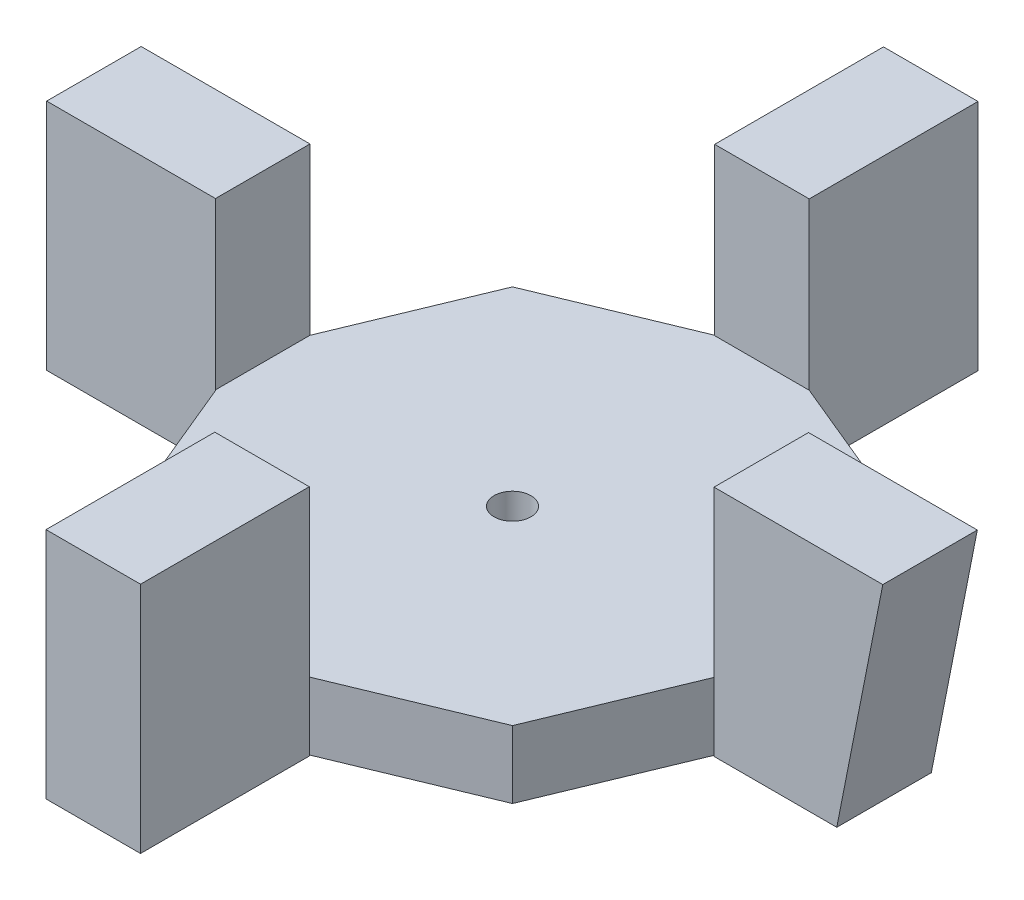
ISO-10303-21;
HEADER;
FILE_DESCRIPTION(('STEP AP214'),'2;1');
FILE_NAME('part.step','',(''),(''),'','','');
FILE_SCHEMA(('AUTOMOTIVE_DESIGN { 1 0 10303 214 1 1 1 1 }'));
ENDSEC;
DATA;
#1=APPLICATION_CONTEXT('core data for automotive mechanical design processes');
#2=APPLICATION_PROTOCOL_DEFINITION('international standard','automotive_design',2000,#1);
#3=PRODUCT_CONTEXT('',#1,'mechanical');
#4=PRODUCT('Part','Part','',(#3));
#5=PRODUCT_RELATED_PRODUCT_CATEGORY('part','',(#4));
#6=PRODUCT_DEFINITION_FORMATION('','',#4);
#7=PRODUCT_DEFINITION_CONTEXT('part definition',#1,'design');
#8=PRODUCT_DEFINITION('design','',#6,#7);
#9=PRODUCT_DEFINITION_SHAPE('','',#8);
#10=(LENGTH_UNIT() NAMED_UNIT(*) SI_UNIT(.MILLI.,.METRE.));
#11=(NAMED_UNIT(*) PLANE_ANGLE_UNIT() SI_UNIT($,.RADIAN.));
#12=(NAMED_UNIT(*) SI_UNIT($,.STERADIAN.) SOLID_ANGLE_UNIT());
#13=UNCERTAINTY_MEASURE_WITH_UNIT(LENGTH_MEASURE(1.E-05),#10,'distance_accuracy_value','');
#14=(GEOMETRIC_REPRESENTATION_CONTEXT(3) GLOBAL_UNCERTAINTY_ASSIGNED_CONTEXT((#13)) GLOBAL_UNIT_ASSIGNED_CONTEXT((#10,
#11,#12)) REPRESENTATION_CONTEXT('',''));
#15=CARTESIAN_POINT('',(0.,0.,0.));
#16=DIRECTION('',(0.,0.,1.));
#17=DIRECTION('',(1.,0.,0.));
#18=AXIS2_PLACEMENT_3D('',#15,#16,#17);
#19=CARTESIAN_POINT('',(0.,2.75,0.));
#20=DIRECTION('',(0.,1.,0.));
#21=DIRECTION('',(0.,0.,1.));
#22=AXIS2_PLACEMENT_3D('',#19,#20,#21);
#23=PLANE('',#22);
#24=CARTESIAN_POINT('',(0.,2.75,0.));
#25=DIRECTION('',(0.,1.,0.));
#26=DIRECTION('',(0.,0.,1.));
#27=AXIS2_PLACEMENT_3D('',#24,#25,#26);
#28=CIRCLE('',#27,1.5);
#29=CARTESIAN_POINT('',(0.,2.75,1.5));
#30=VERTEX_POINT('',#29);
#31=EDGE_CURVE('E294',#30,#30,#28,.T.);
#32=ORIENTED_EDGE('',*,*,#31,.F.);
#33=EDGE_LOOP('',(#32));
#34=FACE_BOUND('',#33,.T.);
#35=DIRECTION('',(0.382683432365083,0.,-0.92387953251129));
#36=VECTOR('',#35,1.);
#37=CARTESIAN_POINT('',(18.6803767433291,2.75,7.73766539732571));
#38=LINE('',#37,#36);
#39=CARTESIAN_POINT('',(15.4753307946518,2.75,15.4753307946516));
#40=VERTEX_POINT('',#39);
#41=CARTESIAN_POINT('',(20.3613567830072,2.75,3.6794205874563));
#42=VERTEX_POINT('',#41);
#43=EDGE_CURVE('E457',#40,#42,#38,.T.);
#44=ORIENTED_EDGE('',*,*,#43,.T.);
#45=DIRECTION('',(0.,0.,-1.));
#46=VECTOR('',#45,1.);
#47=CARTESIAN_POINT('',(20.3613567830072,2.75,0.));
#48=LINE('',#47,#46);
#49=CARTESIAN_POINT('',(20.3613567830072,2.75,-3.67942058745647));
#50=VERTEX_POINT('',#49);
#51=EDGE_CURVE('E401',#42,#50,#48,.T.);
#52=ORIENTED_EDGE('',*,*,#51,.T.);
#53=DIRECTION('',(-0.382683432365095,0.,-0.923879532511284));
#54=VECTOR('',#53,1.);
#55=CARTESIAN_POINT('',(18.680376743329,2.75,-7.73766539732596));
#56=LINE('',#55,#54);
#57=CARTESIAN_POINT('',(15.4753307946516,2.75,-15.4753307946518));
#58=VERTEX_POINT('',#57);
#59=EDGE_CURVE('E459',#50,#58,#56,.T.);
#60=ORIENTED_EDGE('',*,*,#59,.T.);
#61=DIRECTION('',(-0.923879532511289,0.,-0.382683432365084));
#62=VECTOR('',#61,1.);
#63=CARTESIAN_POINT('',(7.73766539732573,2.75,-18.6803767433291));
#64=LINE('',#63,#62);
#65=CARTESIAN_POINT('',(3.90464976156508,2.75,-20.2680638044493));
#66=VERTEX_POINT('',#65);
#67=EDGE_CURVE('E461',#58,#66,#64,.T.);
#68=ORIENTED_EDGE('',*,*,#67,.T.);
#69=DIRECTION('',(-1.,0.,0.));
#70=VECTOR('',#69,1.);
#71=CARTESIAN_POINT('',(0.,2.75,-20.2680638044493));
#72=LINE('',#71,#70);
#73=CARTESIAN_POINT('',(-3.79535023843491,2.75,-20.2680638044493));
#74=VERTEX_POINT('',#73);
#75=EDGE_CURVE('E426',#66,#74,#72,.T.);
#76=ORIENTED_EDGE('',*,*,#75,.T.);
#77=DIRECTION('',(0.,0.,1.));
#78=VECTOR('',#77,1.);
#79=CARTESIAN_POINT('',(-3.7953502384349,2.75,0.));
#80=LINE('',#79,#78);
#81=CARTESIAN_POINT('',(-3.79535023843491,2.75,-20.3133371492908));
#82=VERTEX_POINT('',#81);
#83=EDGE_CURVE('E424',#82,#74,#80,.T.);
#84=ORIENTED_EDGE('',*,*,#83,.F.);
#85=DIRECTION('',(-0.923879532511285,0.,0.382683432365095));
#86=VECTOR('',#85,1.);
#87=CARTESIAN_POINT('',(-7.73766539732596,2.75,-18.680376743329));
#88=LINE('',#87,#86);
#89=CARTESIAN_POINT('',(-15.4753307946518,2.75,-15.4753307946516));
#90=VERTEX_POINT('',#89);
#91=EDGE_CURVE('E60',#82,#90,#88,.T.);
#92=ORIENTED_EDGE('',*,*,#91,.T.);
#93=DIRECTION('',(-0.382683432365084,0.,0.923879532511289));
#94=VECTOR('',#93,1.);
#95=CARTESIAN_POINT('',(-18.6803767433291,2.75,-7.73766539732573));
#96=LINE('',#95,#94);
#97=CARTESIAN_POINT('',(-20.3067070214421,2.75,-3.8113567830072));
#98=VERTEX_POINT('',#97);
#99=EDGE_CURVE('E465',#90,#98,#96,.T.);
#100=ORIENTED_EDGE('',*,*,#99,.T.);
#101=DIRECTION('',(0.,0.,1.));
#102=VECTOR('',#101,1.);
#103=CARTESIAN_POINT('',(-20.3067070214421,2.75,0.));
#104=LINE('',#103,#102);
#105=CARTESIAN_POINT('',(-20.3067070214421,2.75,3.81135678300735));
#106=VERTEX_POINT('',#105);
#107=EDGE_CURVE('E11',#98,#106,#104,.T.);
#108=ORIENTED_EDGE('',*,*,#107,.T.);
#109=DIRECTION('',(0.382683432365096,0.,0.923879532511284));
#110=VECTOR('',#109,1.);
#111=CARTESIAN_POINT('',(-18.680376743329,2.75,7.73766539732596));
#112=LINE('',#111,#110);
#113=CARTESIAN_POINT('',(-15.4753307946516,2.75,15.4753307946518));
#114=VERTEX_POINT('',#113);
#115=EDGE_CURVE('E150',#106,#114,#112,.T.);
#116=ORIENTED_EDGE('',*,*,#115,.T.);
#117=DIRECTION('',(0.923879532511289,0.,0.382683432365084));
#118=VECTOR('',#117,1.);
#119=CARTESIAN_POINT('',(-7.73766539732573,2.75,18.6803767433291));
#120=LINE('',#119,#118);
#121=CARTESIAN_POINT('',(-3.5861276088986,2.75,20.4));
#122=VERTEX_POINT('',#121);
#123=EDGE_CURVE('E351',#114,#122,#120,.T.);
#124=ORIENTED_EDGE('',*,*,#123,.T.);
#125=DIRECTION('',(-1.,0.,0.));
#126=VECTOR('',#125,1.);
#127=CARTESIAN_POINT('',(0.,2.75,20.4));
#128=LINE('',#127,#126);
#129=CARTESIAN_POINT('',(3.58612760889877,2.75,20.4));
#130=VERTEX_POINT('',#129);
#131=EDGE_CURVE('E52',#130,#122,#128,.T.);
#132=ORIENTED_EDGE('',*,*,#131,.F.);
#133=DIRECTION('',(0.923879532511284,0.,-0.382683432365096));
#134=VECTOR('',#133,1.);
#135=CARTESIAN_POINT('',(7.73766539732596,2.75,18.680376743329));
#136=LINE('',#135,#134);
#137=EDGE_CURVE('E354',#130,#40,#136,.T.);
#138=ORIENTED_EDGE('',*,*,#137,.T.);
#139=EDGE_LOOP('',(#44,#52,#60,#68,#76,#84,#92,#100,#108,#116,#124,#132,#138));
#140=FACE_BOUND('',#139,.T.);
#141=ADVANCED_FACE('F43',(#34,#140),#23,.T.);
#142=CARTESIAN_POINT('',(-20.3067070214421,2.75,0.));
#143=DIRECTION('',(-1.,0.,0.));
#144=DIRECTION('',(0.,0.,1.));
#145=AXIS2_PLACEMENT_3D('',#142,#143,#144);
#146=PLANE('',#145);
#147=DIRECTION('',(0.,-1.,0.));
#148=VECTOR('',#147,1.);
#149=CARTESIAN_POINT('',(-20.3067070214421,2.75,3.88864321699279));
#150=LINE('',#149,#148);
#151=CARTESIAN_POINT('',(-20.3067070214421,16.25,3.88864321699279));
#152=VERTEX_POINT('',#151);
#153=CARTESIAN_POINT('',(-20.3067070214421,-2.75,3.88864321699279));
#154=VERTEX_POINT('',#153);
#155=EDGE_CURVE('E144',#152,#154,#150,.T.);
#156=ORIENTED_EDGE('',*,*,#155,.T.);
#157=DIRECTION('',(0.,0.,-1.));
#158=VECTOR('',#157,1.);
#159=CARTESIAN_POINT('',(-20.3067070214421,-2.75,0.));
#160=LINE('',#159,#158);
#161=CARTESIAN_POINT('',(-20.3067070214421,-2.75,3.81135678300735));
#162=VERTEX_POINT('',#161);
#163=EDGE_CURVE('E454',#154,#162,#160,.T.);
#164=ORIENTED_EDGE('',*,*,#163,.T.);
#165=DIRECTION('',(0.,-1.,0.));
#166=VECTOR('',#165,1.);
#167=CARTESIAN_POINT('',(-20.3067070214421,2.75,3.81135678300735));
#168=LINE('',#167,#166);
#169=EDGE_CURVE('E341',#106,#162,#168,.T.);
#170=ORIENTED_EDGE('',*,*,#169,.F.);
#171=ORIENTED_EDGE('',*,*,#107,.F.);
#172=DIRECTION('',(0.,-1.,0.));
#173=VECTOR('',#172,1.);
#174=CARTESIAN_POINT('',(-20.3067070214421,16.25,-3.8113567830072));
#175=LINE('',#174,#173);
#176=CARTESIAN_POINT('',(-20.3067070214421,16.25,-3.8113567830072));
#177=VERTEX_POINT('',#176);
#178=EDGE_CURVE('E439',#177,#98,#175,.T.);
#179=ORIENTED_EDGE('',*,*,#178,.F.);
#180=DIRECTION('',(0.,0.,-1.));
#181=VECTOR('',#180,1.);
#182=CARTESIAN_POINT('',(-20.3067070214421,16.25,0.));
#183=LINE('',#182,#181);
#184=EDGE_CURVE('E429',#152,#177,#183,.T.);
#185=ORIENTED_EDGE('',*,*,#184,.F.);
#186=EDGE_LOOP('',(#156,#164,#170,#171,#179,#185));
#187=FACE_BOUND('',#186,.T.);
#188=ADVANCED_FACE('F45',(#187),#146,.F.);
#189=CARTESIAN_POINT('',(-18.680376743329,2.75,7.73766539732596));
#190=DIRECTION('',(0.923879532511285,0.,-0.382683432365096));
#191=DIRECTION('',(-0.382683432365095,0.,-0.923879532511284));
#192=AXIS2_PLACEMENT_3D('',#189,#190,#191);
#193=PLANE('',#192);
#194=DIRECTION('',(0.382683432365096,0.,0.923879532511284));
#195=VECTOR('',#194,1.);
#196=CARTESIAN_POINT('',(-18.680376743329,-2.75,7.73766539732596));
#197=LINE('',#196,#195);
#198=CARTESIAN_POINT('',(-15.4753307946516,-2.75,15.4753307946518));
#199=VERTEX_POINT('',#198);
#200=EDGE_CURVE('E362',#162,#199,#197,.T.);
#201=ORIENTED_EDGE('',*,*,#200,.T.);
#202=DIRECTION('',(0.,-1.,0.));
#203=VECTOR('',#202,1.);
#204=CARTESIAN_POINT('',(-15.4753307946516,2.75,15.4753307946518));
#205=LINE('',#204,#203);
#206=EDGE_CURVE('E338',#114,#199,#205,.T.);
#207=ORIENTED_EDGE('',*,*,#206,.F.);
#208=ORIENTED_EDGE('',*,*,#115,.F.);
#209=ORIENTED_EDGE('',*,*,#169,.T.);
#210=EDGE_LOOP('',(#201,#207,#208,#209));
#211=FACE_BOUND('',#210,.T.);
#212=ADVANCED_FACE('F471',(#211),#193,.F.);
#213=CARTESIAN_POINT('',(-7.73766539732573,2.75,18.6803767433291));
#214=DIRECTION('',(0.382683432365084,0.,-0.923879532511289));
#215=DIRECTION('',(-0.923879532511289,0.,-0.382683432365084));
#216=AXIS2_PLACEMENT_3D('',#213,#214,#215);
#217=PLANE('',#216);
#218=DIRECTION('',(0.923879532511289,0.,0.382683432365084));
#219=VECTOR('',#218,1.);
#220=CARTESIAN_POINT('',(-7.73766539732573,-2.75,18.6803767433291));
#221=LINE('',#220,#219);
#222=CARTESIAN_POINT('',(-3.5861276088986,-2.75,20.4));
#223=VERTEX_POINT('',#222);
#224=EDGE_CURVE('E358',#199,#223,#221,.T.);
#225=ORIENTED_EDGE('',*,*,#224,.T.);
#226=DIRECTION('',(0.,-1.,0.));
#227=VECTOR('',#226,1.);
#228=CARTESIAN_POINT('',(-3.5861276088986,2.75,20.4));
#229=LINE('',#228,#227);
#230=EDGE_CURVE('E336',#122,#223,#229,.T.);
#231=ORIENTED_EDGE('',*,*,#230,.F.);
#232=ORIENTED_EDGE('',*,*,#123,.F.);
#233=ORIENTED_EDGE('',*,*,#206,.T.);
#234=EDGE_LOOP('',(#225,#231,#232,#233));
#235=FACE_BOUND('',#234,.T.);
#236=ADVANCED_FACE('F356',(#235),#217,.F.);
#237=CARTESIAN_POINT('',(-3.84999999999996,2.75,0.));
#238=DIRECTION('',(-1.,0.,0.));
#239=DIRECTION('',(0.,0.,1.));
#240=AXIS2_PLACEMENT_3D('',#237,#238,#239);
#241=PLANE('',#240);
#242=DIRECTION('',(0.,-1.,0.));
#243=VECTOR('',#242,1.);
#244=CARTESIAN_POINT('',(-3.84999999999998,2.75,20.4));
#245=LINE('',#244,#243);
#246=CARTESIAN_POINT('',(-3.84999999999998,16.25,20.4));
#247=VERTEX_POINT('',#246);
#248=CARTESIAN_POINT('',(-3.84999999999998,-2.75,20.4));
#249=VERTEX_POINT('',#248);
#250=EDGE_CURVE('E334',#247,#249,#245,.T.);
#251=ORIENTED_EDGE('',*,*,#250,.T.);
#252=DIRECTION('',(0.,0.,-1.));
#253=VECTOR('',#252,1.);
#254=CARTESIAN_POINT('',(-3.84999999999996,-2.75,0.));
#255=LINE('',#254,#253);
#256=CARTESIAN_POINT('',(-3.85,-2.75,34.15));
#257=VERTEX_POINT('',#256);
#258=EDGE_CURVE('E367',#257,#249,#255,.T.);
#259=ORIENTED_EDGE('',*,*,#258,.F.);
#260=DIRECTION('',(0.,-1.,0.));
#261=VECTOR('',#260,1.);
#262=CARTESIAN_POINT('',(-3.85,2.75,34.15));
#263=LINE('',#262,#261);
#264=CARTESIAN_POINT('',(-3.85,16.25,34.15));
#265=VERTEX_POINT('',#264);
#266=EDGE_CURVE('E332',#265,#257,#263,.T.);
#267=ORIENTED_EDGE('',*,*,#266,.F.);
#268=DIRECTION('',(0.,0.,-1.));
#269=VECTOR('',#268,1.);
#270=CARTESIAN_POINT('',(-3.84999999999996,16.25,0.));
#271=LINE('',#270,#269);
#272=EDGE_CURVE('E445',#265,#247,#271,.T.);
#273=ORIENTED_EDGE('',*,*,#272,.T.);
#274=EDGE_LOOP('',(#251,#259,#267,#273));
#275=FACE_BOUND('',#274,.T.);
#276=ADVANCED_FACE('F526',(#275),#241,.T.);
#277=CARTESIAN_POINT('',(0.,2.75,34.15));
#278=DIRECTION('',(0.,0.,1.));
#279=DIRECTION('',(1.,0.,0.));
#280=AXIS2_PLACEMENT_3D('',#277,#278,#279);
#281=PLANE('',#280);
#282=ORIENTED_EDGE('',*,*,#266,.T.);
#283=DIRECTION('',(-1.,0.,0.));
#284=VECTOR('',#283,1.);
#285=CARTESIAN_POINT('',(0.,-2.75,34.15));
#286=LINE('',#285,#284);
#287=CARTESIAN_POINT('',(3.85,-2.75,34.15));
#288=VERTEX_POINT('',#287);
#289=EDGE_CURVE('E370',#288,#257,#286,.T.);
#290=ORIENTED_EDGE('',*,*,#289,.F.);
#291=DIRECTION('',(0.,-1.,0.));
#292=VECTOR('',#291,1.);
#293=CARTESIAN_POINT('',(3.85,2.75,34.15));
#294=LINE('',#293,#292);
#295=CARTESIAN_POINT('',(3.85,16.25,34.15));
#296=VERTEX_POINT('',#295);
#297=EDGE_CURVE('E330',#296,#288,#294,.T.);
#298=ORIENTED_EDGE('',*,*,#297,.F.);
#299=DIRECTION('',(-1.,0.,0.));
#300=VECTOR('',#299,1.);
#301=CARTESIAN_POINT('',(0.,16.25,34.15));
#302=LINE('',#301,#300);
#303=EDGE_CURVE('E448',#296,#265,#302,.T.);
#304=ORIENTED_EDGE('',*,*,#303,.T.);
#305=EDGE_LOOP('',(#282,#290,#298,#304));
#306=FACE_BOUND('',#305,.T.);
#307=ADVANCED_FACE('F529',(#306),#281,.T.);
#308=CARTESIAN_POINT('',(3.85000000000001,2.75,0.));
#309=DIRECTION('',(1.,0.,0.));
#310=DIRECTION('',(0.,0.,-1.));
#311=AXIS2_PLACEMENT_3D('',#308,#309,#310);
#312=PLANE('',#311);
#313=ORIENTED_EDGE('',*,*,#297,.T.);
#314=DIRECTION('',(0.,0.,1.));
#315=VECTOR('',#314,1.);
#316=CARTESIAN_POINT('',(3.85000000000001,-2.75,0.));
#317=LINE('',#316,#315);
#318=CARTESIAN_POINT('',(3.85,-2.75,20.4));
#319=VERTEX_POINT('',#318);
#320=EDGE_CURVE('E374',#319,#288,#317,.T.);
#321=ORIENTED_EDGE('',*,*,#320,.F.);
#322=DIRECTION('',(0.,-1.,0.));
#323=VECTOR('',#322,1.);
#324=CARTESIAN_POINT('',(3.85,2.75,20.4));
#325=LINE('',#324,#323);
#326=CARTESIAN_POINT('',(3.85,16.25,20.4));
#327=VERTEX_POINT('',#326);
#328=EDGE_CURVE('E328',#327,#319,#325,.T.);
#329=ORIENTED_EDGE('',*,*,#328,.F.);
#330=DIRECTION('',(0.,0.,1.));
#331=VECTOR('',#330,1.);
#332=CARTESIAN_POINT('',(3.85000000000001,16.25,0.));
#333=LINE('',#332,#331);
#334=EDGE_CURVE('E451',#327,#296,#333,.T.);
#335=ORIENTED_EDGE('',*,*,#334,.T.);
#336=EDGE_LOOP('',(#313,#321,#329,#335));
#337=FACE_BOUND('',#336,.T.);
#338=ADVANCED_FACE('F531',(#337),#312,.T.);
#339=CARTESIAN_POINT('',(0.,2.75,20.4));
#340=DIRECTION('',(0.,0.,-1.));
#341=DIRECTION('',(-1.,0.,0.));
#342=AXIS2_PLACEMENT_3D('',#339,#340,#341);
#343=PLANE('',#342);
#344=ORIENTED_EDGE('',*,*,#328,.T.);
#345=DIRECTION('',(1.,0.,0.));
#346=VECTOR('',#345,1.);
#347=CARTESIAN_POINT('',(0.,-2.75,20.4));
#348=LINE('',#347,#346);
#349=CARTESIAN_POINT('',(3.58612760889877,-2.75,20.4));
#350=VERTEX_POINT('',#349);
#351=EDGE_CURVE('E369',#350,#319,#348,.T.);
#352=ORIENTED_EDGE('',*,*,#351,.F.);
#353=DIRECTION('',(0.,-1.,0.));
#354=VECTOR('',#353,1.);
#355=CARTESIAN_POINT('',(3.58612760889877,2.75,20.4));
#356=LINE('',#355,#354);
#357=EDGE_CURVE('E326',#130,#350,#356,.T.);
#358=ORIENTED_EDGE('',*,*,#357,.F.);
#359=ORIENTED_EDGE('',*,*,#131,.T.);
#360=ORIENTED_EDGE('',*,*,#230,.T.);
#361=EDGE_CURVE('E361',#249,#223,#348,.T.);
#362=ORIENTED_EDGE('',*,*,#361,.F.);
#363=ORIENTED_EDGE('',*,*,#250,.F.);
#364=DIRECTION('',(1.,0.,0.));
#365=VECTOR('',#364,1.);
#366=CARTESIAN_POINT('',(0.,16.25,20.4));
#367=LINE('',#366,#365);
#368=EDGE_CURVE('E442',#247,#327,#367,.T.);
#369=ORIENTED_EDGE('',*,*,#368,.T.);
#370=EDGE_LOOP('',(#344,#352,#358,#359,#360,#362,#363,#369));
#371=FACE_BOUND('',#370,.T.);
#372=ADVANCED_FACE('F344',(#371),#343,.T.);
#373=CARTESIAN_POINT('',(7.73766539732596,2.75,18.680376743329));
#374=DIRECTION('',(-0.382683432365096,0.,-0.923879532511284));
#375=DIRECTION('',(-0.923879532511284,0.,0.382683432365096));
#376=AXIS2_PLACEMENT_3D('',#373,#374,#375);
#377=PLANE('',#376);
#378=DIRECTION('',(0.923879532511284,0.,-0.382683432365096));
#379=VECTOR('',#378,1.);
#380=CARTESIAN_POINT('',(7.73766539732596,-2.75,18.680376743329));
#381=LINE('',#380,#379);
#382=CARTESIAN_POINT('',(15.4753307946518,-2.75,15.4753307946516));
#383=VERTEX_POINT('',#382);
#384=EDGE_CURVE('E373',#350,#383,#381,.T.);
#385=ORIENTED_EDGE('',*,*,#384,.T.);
#386=DIRECTION('',(0.,-1.,0.));
#387=VECTOR('',#386,1.);
#388=CARTESIAN_POINT('',(15.4753307946518,2.75,15.4753307946516));
#389=LINE('',#388,#387);
#390=EDGE_CURVE('E323',#40,#383,#389,.T.);
#391=ORIENTED_EDGE('',*,*,#390,.F.);
#392=ORIENTED_EDGE('',*,*,#137,.F.);
#393=ORIENTED_EDGE('',*,*,#357,.T.);
#394=EDGE_LOOP('',(#385,#391,#392,#393));
#395=FACE_BOUND('',#394,.T.);
#396=ADVANCED_FACE('F538',(#395),#377,.F.);
#397=CARTESIAN_POINT('',(18.6803767433291,2.75,7.73766539732571));
#398=DIRECTION('',(-0.92387953251129,0.,-0.382683432365083));
#399=DIRECTION('',(-0.382683432365083,0.,0.92387953251129));
#400=AXIS2_PLACEMENT_3D('',#397,#398,#399);
#401=PLANE('',#400);
#402=DIRECTION('',(0.382683432365083,0.,-0.92387953251129));
#403=VECTOR('',#402,1.);
#404=CARTESIAN_POINT('',(18.6803767433291,-2.75,7.73766539732571));
#405=LINE('',#404,#403);
#406=CARTESIAN_POINT('',(20.3613567830072,-2.75,3.6794205874563));
#407=VERTEX_POINT('',#406);
#408=EDGE_CURVE('E377',#383,#407,#405,.T.);
#409=ORIENTED_EDGE('',*,*,#408,.T.);
#410=DIRECTION('',(0.,-1.,0.));
#411=VECTOR('',#410,1.);
#412=CARTESIAN_POINT('',(20.3613567830072,2.75,3.6794205874563));
#413=LINE('',#412,#411);
#414=EDGE_CURVE('E321',#42,#407,#413,.T.);
#415=ORIENTED_EDGE('',*,*,#414,.F.);
#416=ORIENTED_EDGE('',*,*,#43,.F.);
#417=ORIENTED_EDGE('',*,*,#390,.T.);
#418=EDGE_LOOP('',(#409,#415,#416,#417));
#419=FACE_BOUND('',#418,.T.);
#420=ADVANCED_FACE('F586',(#419),#401,.F.);
#421=CARTESIAN_POINT('',(0.,2.75,3.94329297855787));
#422=DIRECTION('',(0.,0.,1.));
#423=DIRECTION('',(1.,0.,0.));
#424=AXIS2_PLACEMENT_3D('',#421,#422,#423);
#425=PLANE('',#424);
#426=DIRECTION('',(-0.19363303189666,-0.981074028276413,0.));
#427=VECTOR('',#426,1.);
#428=CARTESIAN_POINT('',(30.2678214928595,-3.22391213674858,3.94329297855786));
#429=LINE('',#428,#427);
#430=CARTESIAN_POINT('',(34.1113567830072,16.25,3.94329297855786));
#431=VERTEX_POINT('',#430);
#432=CARTESIAN_POINT('',(30.3613567830072,-2.75,3.94329297855786));
#433=VERTEX_POINT('',#432);
#434=EDGE_CURVE('E237',#431,#433,#429,.T.);
#435=ORIENTED_EDGE('',*,*,#434,.F.);
#436=DIRECTION('',(-1.,0.,0.));
#437=VECTOR('',#436,1.);
#438=CARTESIAN_POINT('',(0.,16.25,3.94329297855787));
#439=LINE('',#438,#437);
#440=CARTESIAN_POINT('',(20.3613567830072,16.25,3.94329297855786));
#441=VERTEX_POINT('',#440);
#442=EDGE_CURVE('E396',#431,#441,#439,.T.);
#443=ORIENTED_EDGE('',*,*,#442,.T.);
#444=DIRECTION('',(0.,-1.,0.));
#445=VECTOR('',#444,1.);
#446=CARTESIAN_POINT('',(20.3613567830072,2.75,3.94329297855786));
#447=LINE('',#446,#445);
#448=CARTESIAN_POINT('',(20.3613567830072,-2.75,3.94329297855786));
#449=VERTEX_POINT('',#448);
#450=EDGE_CURVE('E318',#441,#449,#447,.T.);
#451=ORIENTED_EDGE('',*,*,#450,.T.);
#452=DIRECTION('',(-1.,0.,0.));
#453=VECTOR('',#452,1.);
#454=CARTESIAN_POINT('',(0.,-2.75,3.94329297855787));
#455=LINE('',#454,#453);
#456=EDGE_CURVE('E256',#433,#449,#455,.T.);
#457=ORIENTED_EDGE('',*,*,#456,.F.);
#458=EDGE_LOOP('',(#435,#443,#451,#457));
#459=FACE_BOUND('',#458,.T.);
#460=ADVANCED_FACE('F394',(#459),#425,.T.);
#461=CARTESIAN_POINT('',(0.,2.75,-3.75670702144213));
#462=DIRECTION('',(0.,0.,-1.));
#463=DIRECTION('',(-1.,0.,0.));
#464=AXIS2_PLACEMENT_3D('',#461,#462,#463);
#465=PLANE('',#464);
#466=DIRECTION('',(0.19363303189666,0.981074028276413,0.));
#467=VECTOR('',#466,1.);
#468=CARTESIAN_POINT('',(29.7454085616813,-5.87080432138447,-3.75670702144214));
#469=LINE('',#468,#467);
#470=CARTESIAN_POINT('',(30.3613567830072,-2.75,-3.75670702144214));
#471=VERTEX_POINT('',#470);
#472=CARTESIAN_POINT('',(34.1113567830072,16.25,-3.75670702144214));
#473=VERTEX_POINT('',#472);
#474=EDGE_CURVE('E234',#471,#473,#469,.T.);
#475=ORIENTED_EDGE('',*,*,#474,.F.);
#476=DIRECTION('',(1.,0.,0.));
#477=VECTOR('',#476,1.);
#478=CARTESIAN_POINT('',(0.,-2.75,-3.75670702144213));
#479=LINE('',#478,#477);
#480=CARTESIAN_POINT('',(20.3613567830072,-2.75,-3.75670702144213));
#481=VERTEX_POINT('',#480);
#482=EDGE_CURVE('E245',#481,#471,#479,.T.);
#483=ORIENTED_EDGE('',*,*,#482,.F.);
#484=DIRECTION('',(0.,-1.,0.));
#485=VECTOR('',#484,1.);
#486=CARTESIAN_POINT('',(20.3613567830072,2.75,-3.75670702144213));
#487=LINE('',#486,#485);
#488=CARTESIAN_POINT('',(20.3613567830072,16.25,-3.75670702144213));
#489=VERTEX_POINT('',#488);
#490=EDGE_CURVE('E316',#489,#481,#487,.T.);
#491=ORIENTED_EDGE('',*,*,#490,.F.);
#492=DIRECTION('',(1.,0.,0.));
#493=VECTOR('',#492,1.);
#494=CARTESIAN_POINT('',(0.,16.25,-3.75670702144213));
#495=LINE('',#494,#493);
#496=EDGE_CURVE('E247',#489,#473,#495,.T.);
#497=ORIENTED_EDGE('',*,*,#496,.T.);
#498=EDGE_LOOP('',(#475,#483,#491,#497));
#499=FACE_BOUND('',#498,.T.);
#500=ADVANCED_FACE('F244',(#499),#465,.T.);
#501=CARTESIAN_POINT('',(20.3613567830072,2.75,0.));
#502=DIRECTION('',(1.,0.,0.));
#503=DIRECTION('',(0.,0.,-1.));
#504=AXIS2_PLACEMENT_3D('',#501,#502,#503);
#505=PLANE('',#504);
#506=ORIENTED_EDGE('',*,*,#490,.T.);
#507=DIRECTION('',(0.,0.,1.));
#508=VECTOR('',#507,1.);
#509=CARTESIAN_POINT('',(20.3613567830072,-2.75,0.));
#510=LINE('',#509,#508);
#511=CARTESIAN_POINT('',(20.3613567830072,-2.75,-3.67942058745647));
#512=VERTEX_POINT('',#511);
#513=EDGE_CURVE('E255',#481,#512,#510,.T.);
#514=ORIENTED_EDGE('',*,*,#513,.T.);
#515=DIRECTION('',(0.,-1.,0.));
#516=VECTOR('',#515,1.);
#517=CARTESIAN_POINT('',(20.3613567830072,2.75,-3.67942058745647));
#518=LINE('',#517,#516);
#519=EDGE_CURVE('E314',#50,#512,#518,.T.);
#520=ORIENTED_EDGE('',*,*,#519,.F.);
#521=ORIENTED_EDGE('',*,*,#51,.F.);
#522=ORIENTED_EDGE('',*,*,#414,.T.);
#523=EDGE_CURVE('E260',#407,#449,#510,.T.);
#524=ORIENTED_EDGE('',*,*,#523,.T.);
#525=ORIENTED_EDGE('',*,*,#450,.F.);
#526=DIRECTION('',(0.,0.,1.));
#527=VECTOR('',#526,1.);
#528=CARTESIAN_POINT('',(20.3613567830072,16.25,0.));
#529=LINE('',#528,#527);
#530=EDGE_CURVE('E399',#489,#441,#529,.T.);
#531=ORIENTED_EDGE('',*,*,#530,.F.);
#532=EDGE_LOOP('',(#506,#514,#520,#521,#522,#524,#525,#531));
#533=FACE_BOUND('',#532,.T.);
#534=ADVANCED_FACE('F387',(#533),#505,.F.);
#535=CARTESIAN_POINT('',(18.680376743329,2.75,-7.73766539732596));
#536=DIRECTION('',(-0.923879532511285,0.,0.382683432365095));
#537=DIRECTION('',(0.382683432365095,0.,0.923879532511285));
#538=AXIS2_PLACEMENT_3D('',#535,#536,#537);
#539=PLANE('',#538);
#540=DIRECTION('',(-0.382683432365095,0.,-0.923879532511284));
#541=VECTOR('',#540,1.);
#542=CARTESIAN_POINT('',(18.680376743329,-2.75,-7.73766539732596));
#543=LINE('',#542,#541);
#544=CARTESIAN_POINT('',(15.4753307946516,-2.75,-15.4753307946518));
#545=VERTEX_POINT('',#544);
#546=EDGE_CURVE('E258',#512,#545,#543,.T.);
#547=ORIENTED_EDGE('',*,*,#546,.T.);
#548=DIRECTION('',(0.,-1.,0.));
#549=VECTOR('',#548,1.);
#550=CARTESIAN_POINT('',(15.4753307946516,2.75,-15.4753307946518));
#551=LINE('',#550,#549);
#552=EDGE_CURVE('E311',#58,#545,#551,.T.);
#553=ORIENTED_EDGE('',*,*,#552,.F.);
#554=ORIENTED_EDGE('',*,*,#59,.F.);
#555=ORIENTED_EDGE('',*,*,#519,.T.);
#556=EDGE_LOOP('',(#547,#553,#554,#555));
#557=FACE_BOUND('',#556,.T.);
#558=ADVANCED_FACE('F609',(#557),#539,.F.);
#559=CARTESIAN_POINT('',(7.73766539732573,2.75,-18.6803767433291));
#560=DIRECTION('',(-0.382683432365084,0.,0.923879532511289));
#561=DIRECTION('',(0.923879532511289,0.,0.382683432365084));
#562=AXIS2_PLACEMENT_3D('',#559,#560,#561);
#563=PLANE('',#562);
#564=DIRECTION('',(-0.923879532511289,0.,-0.382683432365084));
#565=VECTOR('',#564,1.);
#566=CARTESIAN_POINT('',(7.73766539732573,-2.75,-18.6803767433291));
#567=LINE('',#566,#565);
#568=CARTESIAN_POINT('',(3.90464976156508,-2.75,-20.2680638044493));
#569=VERTEX_POINT('',#568);
#570=EDGE_CURVE('E264',#545,#569,#567,.T.);
#571=ORIENTED_EDGE('',*,*,#570,.T.);
#572=DIRECTION('',(0.,-1.,0.));
#573=VECTOR('',#572,1.);
#574=CARTESIAN_POINT('',(3.90464976156508,2.75,-20.2680638044493));
#575=LINE('',#574,#573);
#576=EDGE_CURVE('E309',#66,#569,#575,.T.);
#577=ORIENTED_EDGE('',*,*,#576,.F.);
#578=ORIENTED_EDGE('',*,*,#67,.F.);
#579=ORIENTED_EDGE('',*,*,#552,.T.);
#580=EDGE_LOOP('',(#571,#577,#578,#579));
#581=FACE_BOUND('',#580,.T.);
#582=ADVANCED_FACE('F622',(#581),#563,.F.);
#583=CARTESIAN_POINT('',(3.90464976156509,2.75,0.));
#584=DIRECTION('',(1.,0.,0.));
#585=DIRECTION('',(0.,0.,-1.));
#586=AXIS2_PLACEMENT_3D('',#583,#584,#585);
#587=PLANE('',#586);
#588=ORIENTED_EDGE('',*,*,#576,.T.);
#589=DIRECTION('',(0.,0.,1.));
#590=VECTOR('',#589,1.);
#591=CARTESIAN_POINT('',(3.90464976156509,-2.75,0.));
#592=LINE('',#591,#590);
#593=CARTESIAN_POINT('',(3.90464976156508,-2.75,-34.0180638044493));
#594=VERTEX_POINT('',#593);
#595=EDGE_CURVE('E267',#594,#569,#592,.T.);
#596=ORIENTED_EDGE('',*,*,#595,.F.);
#597=DIRECTION('',(0.,-1.,0.));
#598=VECTOR('',#597,1.);
#599=CARTESIAN_POINT('',(3.90464976156508,2.75,-34.0180638044493));
#600=LINE('',#599,#598);
#601=CARTESIAN_POINT('',(3.90464976156508,16.25,-34.0180638044493));
#602=VERTEX_POINT('',#601);
#603=EDGE_CURVE('E307',#602,#594,#600,.T.);
#604=ORIENTED_EDGE('',*,*,#603,.F.);
#605=DIRECTION('',(0.,0.,1.));
#606=VECTOR('',#605,1.);
#607=CARTESIAN_POINT('',(3.90464976156509,16.25,0.));
#608=LINE('',#607,#606);
#609=CARTESIAN_POINT('',(3.90464976156508,16.25,-20.2680638044493));
#610=VERTEX_POINT('',#609);
#611=EDGE_CURVE('E412',#602,#610,#608,.T.);
#612=ORIENTED_EDGE('',*,*,#611,.T.);
#613=DIRECTION('',(0.,-1.,0.));
#614=VECTOR('',#613,1.);
#615=CARTESIAN_POINT('',(3.90464976156508,16.25,-20.2680638044493));
#616=LINE('',#615,#614);
#617=EDGE_CURVE('E418',#610,#66,#616,.T.);
#618=ORIENTED_EDGE('',*,*,#617,.T.);
#619=EDGE_LOOP('',(#588,#596,#604,#612,#618));
#620=FACE_BOUND('',#619,.T.);
#621=ADVANCED_FACE('F634',(#620),#587,.T.);
#622=CARTESIAN_POINT('',(0.,2.75,-34.0180638044493));
#623=DIRECTION('',(0.,0.,-1.));
#624=DIRECTION('',(-1.,0.,0.));
#625=AXIS2_PLACEMENT_3D('',#622,#623,#624);
#626=PLANE('',#625);
#627=ORIENTED_EDGE('',*,*,#603,.T.);
#628=DIRECTION('',(1.,0.,0.));
#629=VECTOR('',#628,1.);
#630=CARTESIAN_POINT('',(0.,-2.75,-34.0180638044493));
#631=LINE('',#630,#629);
#632=CARTESIAN_POINT('',(-3.79535023843492,-2.75,-34.0180638044493));
#633=VERTEX_POINT('',#632);
#634=EDGE_CURVE('E270',#633,#594,#631,.T.);
#635=ORIENTED_EDGE('',*,*,#634,.F.);
#636=DIRECTION('',(0.,-1.,0.));
#637=VECTOR('',#636,1.);
#638=CARTESIAN_POINT('',(-3.79535023843492,2.75,-34.0180638044493));
#639=LINE('',#638,#637);
#640=CARTESIAN_POINT('',(-3.79535023843492,16.25,-34.0180638044493));
#641=VERTEX_POINT('',#640);
#642=EDGE_CURVE('E305',#641,#633,#639,.T.);
#643=ORIENTED_EDGE('',*,*,#642,.F.);
#644=DIRECTION('',(1.,0.,0.));
#645=VECTOR('',#644,1.);
#646=CARTESIAN_POINT('',(0.,16.25,-34.0180638044493));
#647=LINE('',#646,#645);
#648=EDGE_CURVE('E415',#641,#602,#647,.T.);
#649=ORIENTED_EDGE('',*,*,#648,.T.);
#650=EDGE_LOOP('',(#627,#635,#643,#649));
#651=FACE_BOUND('',#650,.T.);
#652=ADVANCED_FACE('F645',(#651),#626,.T.);
#653=CARTESIAN_POINT('',(-3.7953502384349,2.75,0.));
#654=DIRECTION('',(-1.,0.,0.));
#655=DIRECTION('',(0.,0.,1.));
#656=AXIS2_PLACEMENT_3D('',#653,#654,#655);
#657=PLANE('',#656);
#658=ORIENTED_EDGE('',*,*,#642,.T.);
#659=DIRECTION('',(0.,0.,-1.));
#660=VECTOR('',#659,1.);
#661=CARTESIAN_POINT('',(-3.7953502384349,-2.75,0.));
#662=LINE('',#661,#660);
#663=CARTESIAN_POINT('',(-3.79535023843491,-2.75,-20.3133371492908));
#664=VERTEX_POINT('',#663);
#665=EDGE_CURVE('E273',#664,#633,#662,.T.);
#666=ORIENTED_EDGE('',*,*,#665,.F.);
#667=DIRECTION('',(0.,-1.,0.));
#668=VECTOR('',#667,1.);
#669=CARTESIAN_POINT('',(-3.79535023843491,2.75,-20.3133371492908));
#670=LINE('',#669,#668);
#671=EDGE_CURVE('E303',#82,#664,#670,.T.);
#672=ORIENTED_EDGE('',*,*,#671,.F.);
#673=ORIENTED_EDGE('',*,*,#83,.T.);
#674=DIRECTION('',(0.,-1.,0.));
#675=VECTOR('',#674,1.);
#676=CARTESIAN_POINT('',(-3.79535023843491,16.25,-20.2680638044493));
#677=LINE('',#676,#675);
#678=CARTESIAN_POINT('',(-3.79535023843491,16.25,-20.2680638044493));
#679=VERTEX_POINT('',#678);
#680=EDGE_CURVE('E421',#679,#74,#677,.T.);
#681=ORIENTED_EDGE('',*,*,#680,.F.);
#682=DIRECTION('',(0.,0.,-1.));
#683=VECTOR('',#682,1.);
#684=CARTESIAN_POINT('',(-3.7953502384349,16.25,0.));
#685=LINE('',#684,#683);
#686=EDGE_CURVE('E407',#679,#641,#685,.T.);
#687=ORIENTED_EDGE('',*,*,#686,.T.);
#688=EDGE_LOOP('',(#658,#666,#672,#673,#681,#687));
#689=FACE_BOUND('',#688,.T.);
#690=ADVANCED_FACE('F655',(#689),#657,.T.);
#691=CARTESIAN_POINT('',(-7.73766539732596,2.75,-18.680376743329));
#692=DIRECTION('',(0.382683432365095,0.,0.923879532511285));
#693=DIRECTION('',(0.923879532511285,0.,-0.382683432365095));
#694=AXIS2_PLACEMENT_3D('',#691,#692,#693);
#695=PLANE('',#694);
#696=DIRECTION('',(-0.923879532511285,0.,0.382683432365095));
#697=VECTOR('',#696,1.);
#698=CARTESIAN_POINT('',(-7.73766539732596,-2.75,-18.680376743329));
#699=LINE('',#698,#697);
#700=CARTESIAN_POINT('',(-15.4753307946518,-2.75,-15.4753307946516));
#701=VERTEX_POINT('',#700);
#702=EDGE_CURVE('E276',#664,#701,#699,.T.);
#703=ORIENTED_EDGE('',*,*,#702,.T.);
#704=DIRECTION('',(0.,-1.,0.));
#705=VECTOR('',#704,1.);
#706=CARTESIAN_POINT('',(-15.4753307946518,2.75,-15.4753307946516));
#707=LINE('',#706,#705);
#708=EDGE_CURVE('E300',#90,#701,#707,.T.);
#709=ORIENTED_EDGE('',*,*,#708,.F.);
#710=ORIENTED_EDGE('',*,*,#91,.F.);
#711=ORIENTED_EDGE('',*,*,#671,.T.);
#712=EDGE_LOOP('',(#703,#709,#710,#711));
#713=FACE_BOUND('',#712,.T.);
#714=ADVANCED_FACE('F666',(#713),#695,.F.);
#715=CARTESIAN_POINT('',(-18.6803767433291,2.75,-7.73766539732573));
#716=DIRECTION('',(0.923879532511289,0.,0.382683432365084));
#717=DIRECTION('',(0.382683432365084,0.,-0.923879532511289));
#718=AXIS2_PLACEMENT_3D('',#715,#716,#717);
#719=PLANE('',#718);
#720=DIRECTION('',(-0.382683432365084,0.,0.923879532511289));
#721=VECTOR('',#720,1.);
#722=CARTESIAN_POINT('',(-18.6803767433291,-2.75,-7.73766539732573));
#723=LINE('',#722,#721);
#724=CARTESIAN_POINT('',(-20.3067070214421,-2.75,-3.8113567830072));
#725=VERTEX_POINT('',#724);
#726=EDGE_CURVE('E278',#701,#725,#723,.T.);
#727=ORIENTED_EDGE('',*,*,#726,.T.);
#728=DIRECTION('',(0.,-1.,0.));
#729=VECTOR('',#728,1.);
#730=CARTESIAN_POINT('',(-20.3067070214421,2.75,-3.8113567830072));
#731=LINE('',#730,#729);
#732=EDGE_CURVE('E298',#98,#725,#731,.T.);
#733=ORIENTED_EDGE('',*,*,#732,.F.);
#734=ORIENTED_EDGE('',*,*,#99,.F.);
#735=ORIENTED_EDGE('',*,*,#708,.T.);
#736=EDGE_LOOP('',(#727,#733,#734,#735));
#737=FACE_BOUND('',#736,.T.);
#738=ADVANCED_FACE('F481',(#737),#719,.F.);
#739=CARTESIAN_POINT('',(0.,2.75,-3.8113567830072));
#740=DIRECTION('',(0.,0.,-1.));
#741=DIRECTION('',(-1.,0.,0.));
#742=AXIS2_PLACEMENT_3D('',#739,#740,#741);
#743=PLANE('',#742);
#744=ORIENTED_EDGE('',*,*,#732,.T.);
#745=DIRECTION('',(1.,0.,0.));
#746=VECTOR('',#745,1.);
#747=CARTESIAN_POINT('',(0.,-2.75,-3.8113567830072));
#748=LINE('',#747,#746);
#749=CARTESIAN_POINT('',(-34.0567070214421,-2.75,-3.81135678300721));
#750=VERTEX_POINT('',#749);
#751=EDGE_CURVE('E281',#750,#725,#748,.T.);
#752=ORIENTED_EDGE('',*,*,#751,.F.);
#753=DIRECTION('',(0.,-1.,0.));
#754=VECTOR('',#753,1.);
#755=CARTESIAN_POINT('',(-34.0567070214421,2.75,-3.81135678300721));
#756=LINE('',#755,#754);
#757=CARTESIAN_POINT('',(-34.0567070214421,16.25,-3.81135678300721));
#758=VERTEX_POINT('',#757);
#759=EDGE_CURVE('E296',#758,#750,#756,.T.);
#760=ORIENTED_EDGE('',*,*,#759,.F.);
#761=DIRECTION('',(1.,0.,0.));
#762=VECTOR('',#761,1.);
#763=CARTESIAN_POINT('',(0.,16.25,-3.8113567830072));
#764=LINE('',#763,#762);
#765=EDGE_CURVE('E431',#758,#177,#764,.T.);
#766=ORIENTED_EDGE('',*,*,#765,.T.);
#767=ORIENTED_EDGE('',*,*,#178,.T.);
#768=EDGE_LOOP('',(#744,#752,#760,#766,#767));
#769=FACE_BOUND('',#768,.T.);
#770=ADVANCED_FACE('F475',(#769),#743,.T.);
#771=CARTESIAN_POINT('',(-34.0567070214421,2.75,0.));
#772=DIRECTION('',(-1.,0.,0.));
#773=DIRECTION('',(0.,0.,1.));
#774=AXIS2_PLACEMENT_3D('',#771,#772,#773);
#775=PLANE('',#774);
#776=ORIENTED_EDGE('',*,*,#759,.T.);
#777=DIRECTION('',(0.,0.,-1.));
#778=VECTOR('',#777,1.);
#779=CARTESIAN_POINT('',(-34.0567070214421,-2.75,0.));
#780=LINE('',#779,#778);
#781=CARTESIAN_POINT('',(-34.0567070214421,-2.75,3.88864321699279));
#782=VERTEX_POINT('',#781);
#783=EDGE_CURVE('E284',#782,#750,#780,.T.);
#784=ORIENTED_EDGE('',*,*,#783,.F.);
#785=DIRECTION('',(0.,-1.,0.));
#786=VECTOR('',#785,1.);
#787=CARTESIAN_POINT('',(-34.0567070214421,2.75,3.88864321699279));
#788=LINE('',#787,#786);
#789=CARTESIAN_POINT('',(-34.0567070214421,16.25,3.88864321699279));
#790=VERTEX_POINT('',#789);
#791=EDGE_CURVE('E136',#790,#782,#788,.T.);
#792=ORIENTED_EDGE('',*,*,#791,.F.);
#793=DIRECTION('',(0.,0.,-1.));
#794=VECTOR('',#793,1.);
#795=CARTESIAN_POINT('',(-34.0567070214421,16.25,0.));
#796=LINE('',#795,#794);
#797=EDGE_CURVE('E434',#790,#758,#796,.T.);
#798=ORIENTED_EDGE('',*,*,#797,.T.);
#799=EDGE_LOOP('',(#776,#784,#792,#798));
#800=FACE_BOUND('',#799,.T.);
#801=ADVANCED_FACE('F489',(#800),#775,.T.);
#802=CARTESIAN_POINT('',(0.,2.75,3.88864321699278));
#803=DIRECTION('',(0.,0.,1.));
#804=DIRECTION('',(1.,0.,0.));
#805=AXIS2_PLACEMENT_3D('',#802,#803,#804);
#806=PLANE('',#805);
#807=ORIENTED_EDGE('',*,*,#791,.T.);
#808=DIRECTION('',(-1.,0.,0.));
#809=VECTOR('',#808,1.);
#810=CARTESIAN_POINT('',(0.,-2.75,3.88864321699278));
#811=LINE('',#810,#809);
#812=EDGE_CURVE('E287',#154,#782,#811,.T.);
#813=ORIENTED_EDGE('',*,*,#812,.F.);
#814=ORIENTED_EDGE('',*,*,#155,.F.);
#815=DIRECTION('',(-1.,0.,0.));
#816=VECTOR('',#815,1.);
#817=CARTESIAN_POINT('',(0.,16.25,3.88864321699278));
#818=LINE('',#817,#816);
#819=EDGE_CURVE('E437',#152,#790,#818,.T.);
#820=ORIENTED_EDGE('',*,*,#819,.T.);
#821=EDGE_LOOP('',(#807,#813,#814,#820));
#822=FACE_BOUND('',#821,.T.);
#823=ADVANCED_FACE('F490',(#822),#806,.T.);
#824=CARTESIAN_POINT('',(0.,2.75,0.));
#825=DIRECTION('',(0.,-1.,0.));
#826=DIRECTION('',(0.,0.,-1.));
#827=AXIS2_PLACEMENT_3D('',#824,#825,#826);
#828=CYLINDRICAL_SURFACE('',#827,1.5);
#829=ORIENTED_EDGE('',*,*,#31,.T.);
#830=EDGE_LOOP('',(#829));
#831=FACE_BOUND('',#830,.T.);
#832=CARTESIAN_POINT('',(0.,-2.75,0.));
#833=DIRECTION('',(0.,1.,0.));
#834=DIRECTION('',(0.,0.,1.));
#835=AXIS2_PLACEMENT_3D('',#832,#833,#834);
#836=CIRCLE('',#835,1.5);
#837=CARTESIAN_POINT('',(0.,-2.75,1.5));
#838=VERTEX_POINT('',#837);
#839=EDGE_CURVE('E290',#838,#838,#836,.T.);
#840=ORIENTED_EDGE('',*,*,#839,.F.);
#841=EDGE_LOOP('',(#840));
#842=FACE_BOUND('',#841,.T.);
#843=ADVANCED_FACE('F492',(#831,#842),#828,.F.);
#844=CARTESIAN_POINT('',(0.,-2.75,0.));
#845=DIRECTION('',(0.,1.,0.));
#846=DIRECTION('',(0.,0.,1.));
#847=AXIS2_PLACEMENT_3D('',#844,#845,#846);
#848=PLANE('',#847);
#849=ORIENTED_EDGE('',*,*,#482,.T.);
#850=DIRECTION('',(0.,0.,-1.));
#851=VECTOR('',#850,1.);
#852=CARTESIAN_POINT('',(30.3613567830072,-2.75,12.4932929785579));
#853=LINE('',#852,#851);
#854=EDGE_CURVE('E231',#433,#471,#853,.T.);
#855=ORIENTED_EDGE('',*,*,#854,.F.);
#856=ORIENTED_EDGE('',*,*,#456,.T.);
#857=ORIENTED_EDGE('',*,*,#523,.F.);
#858=ORIENTED_EDGE('',*,*,#408,.F.);
#859=ORIENTED_EDGE('',*,*,#384,.F.);
#860=ORIENTED_EDGE('',*,*,#351,.T.);
#861=ORIENTED_EDGE('',*,*,#320,.T.);
#862=ORIENTED_EDGE('',*,*,#289,.T.);
#863=ORIENTED_EDGE('',*,*,#258,.T.);
#864=ORIENTED_EDGE('',*,*,#361,.T.);
#865=ORIENTED_EDGE('',*,*,#224,.F.);
#866=ORIENTED_EDGE('',*,*,#200,.F.);
#867=ORIENTED_EDGE('',*,*,#163,.F.);
#868=ORIENTED_EDGE('',*,*,#812,.T.);
#869=ORIENTED_EDGE('',*,*,#783,.T.);
#870=ORIENTED_EDGE('',*,*,#751,.T.);
#871=ORIENTED_EDGE('',*,*,#726,.F.);
#872=ORIENTED_EDGE('',*,*,#702,.F.);
#873=ORIENTED_EDGE('',*,*,#665,.T.);
#874=ORIENTED_EDGE('',*,*,#634,.T.);
#875=ORIENTED_EDGE('',*,*,#595,.T.);
#876=ORIENTED_EDGE('',*,*,#570,.F.);
#877=ORIENTED_EDGE('',*,*,#546,.F.);
#878=ORIENTED_EDGE('',*,*,#513,.F.);
#879=EDGE_LOOP('',(#849,#855,#856,#857,#858,#859,#860,#861,#862,#863,#864,#865,#866,#867,#868,
#869,#870,#871,#872,#873,#874,#875,#876,#877,#878));
#880=FACE_BOUND('',#879,.T.);
#881=ORIENTED_EDGE('',*,*,#839,.T.);
#882=EDGE_LOOP('',(#881));
#883=FACE_BOUND('',#882,.T.);
#884=ADVANCED_FACE('F251',(#880,#883),#848,.F.);
#885=CARTESIAN_POINT('',(0.,16.25,0.));
#886=DIRECTION('',(0.,1.,0.));
#887=DIRECTION('',(0.,0.,1.));
#888=AXIS2_PLACEMENT_3D('',#885,#886,#887);
#889=PLANE('',#888);
#890=ORIENTED_EDGE('',*,*,#368,.F.);
#891=ORIENTED_EDGE('',*,*,#272,.F.);
#892=ORIENTED_EDGE('',*,*,#303,.F.);
#893=ORIENTED_EDGE('',*,*,#334,.F.);
#894=EDGE_LOOP('',(#890,#891,#892,#893));
#895=FACE_BOUND('',#894,.T.);
#896=ADVANCED_FACE('F510',(#895),#889,.T.);
#897=CARTESIAN_POINT('',(0.,16.25,0.));
#898=DIRECTION('',(0.,1.,0.));
#899=DIRECTION('',(0.,0.,1.));
#900=AXIS2_PLACEMENT_3D('',#897,#898,#899);
#901=PLANE('',#900);
#902=ORIENTED_EDGE('',*,*,#184,.T.);
#903=ORIENTED_EDGE('',*,*,#765,.F.);
#904=ORIENTED_EDGE('',*,*,#797,.F.);
#905=ORIENTED_EDGE('',*,*,#819,.F.);
#906=EDGE_LOOP('',(#902,#903,#904,#905));
#907=FACE_BOUND('',#906,.T.);
#908=ADVANCED_FACE('F487',(#907),#901,.T.);
#909=CARTESIAN_POINT('',(0.,16.25,-20.2680638044493));
#910=DIRECTION('',(0.,0.,-1.));
#911=DIRECTION('',(-1.,0.,0.));
#912=AXIS2_PLACEMENT_3D('',#909,#910,#911);
#913=PLANE('',#912);
#914=ORIENTED_EDGE('',*,*,#75,.F.);
#915=ORIENTED_EDGE('',*,*,#617,.F.);
#916=DIRECTION('',(1.,0.,0.));
#917=VECTOR('',#916,1.);
#918=CARTESIAN_POINT('',(0.,16.25,-20.2680638044493));
#919=LINE('',#918,#917);
#920=EDGE_CURVE('E410',#679,#610,#919,.T.);
#921=ORIENTED_EDGE('',*,*,#920,.F.);
#922=ORIENTED_EDGE('',*,*,#680,.T.);
#923=EDGE_LOOP('',(#914,#915,#921,#922));
#924=FACE_BOUND('',#923,.T.);
#925=ADVANCED_FACE('F520',(#924),#913,.F.);
#926=CARTESIAN_POINT('',(0.,16.25,0.));
#927=DIRECTION('',(0.,1.,0.));
#928=DIRECTION('',(0.,0.,1.));
#929=AXIS2_PLACEMENT_3D('',#926,#927,#928);
#930=PLANE('',#929);
#931=ORIENTED_EDGE('',*,*,#686,.F.);
#932=ORIENTED_EDGE('',*,*,#920,.T.);
#933=ORIENTED_EDGE('',*,*,#611,.F.);
#934=ORIENTED_EDGE('',*,*,#648,.F.);
#935=EDGE_LOOP('',(#931,#932,#933,#934));
#936=FACE_BOUND('',#935,.T.);
#937=ADVANCED_FACE('F729',(#936),#930,.T.);
#938=CARTESIAN_POINT('',(0.,16.25,0.));
#939=DIRECTION('',(0.,1.,0.));
#940=DIRECTION('',(0.,0.,1.));
#941=AXIS2_PLACEMENT_3D('',#938,#939,#940);
#942=PLANE('',#941);
#943=ORIENTED_EDGE('',*,*,#496,.F.);
#944=ORIENTED_EDGE('',*,*,#530,.T.);
#945=ORIENTED_EDGE('',*,*,#442,.F.);
#946=DIRECTION('',(0.,0.,1.));
#947=VECTOR('',#946,1.);
#948=CARTESIAN_POINT('',(34.1113567830072,16.25,0.));
#949=LINE('',#948,#947);
#950=EDGE_CURVE('E398',#473,#431,#949,.T.);
#951=ORIENTED_EDGE('',*,*,#950,.F.);
#952=EDGE_LOOP('',(#943,#944,#945,#951));
#953=FACE_BOUND('',#952,.T.);
#954=ADVANCED_FACE('F741',(#953),#942,.T.);
#955=CARTESIAN_POINT('',(29.7454085616813,-5.87080432138447,12.4932929785579));
#956=DIRECTION('',(-0.981074028276412,0.19363303189666,0.));
#957=DIRECTION('',(-0.19363303189666,-0.981074028276413,0.));
#958=AXIS2_PLACEMENT_3D('',#955,#956,#957);
#959=PLANE('',#958);
#960=ORIENTED_EDGE('',*,*,#434,.T.);
#961=ORIENTED_EDGE('',*,*,#854,.T.);
#962=ORIENTED_EDGE('',*,*,#474,.T.);
#963=ORIENTED_EDGE('',*,*,#950,.T.);
#964=EDGE_LOOP('',(#960,#961,#962,#963));
#965=FACE_BOUND('',#964,.T.);
#966=ADVANCED_FACE('F233',(#965),#959,.F.);
#967=CLOSED_SHELL('',(#141,#188,#212,#236,#276,#307,#338,#372,#396,#420,#460,#500,#534,#558,
#582,#621,#652,#690,#714,#738,#770,#801,#823,#843,#884,#896,#908,#925,#937,#954,#966));
#968=MANIFOLD_SOLID_BREP('B2',#967);
#969=ADVANCED_BREP_SHAPE_REPRESENTATION('',(#18,#968),#14);
#970=SHAPE_DEFINITION_REPRESENTATION(#9,#969);
ENDSEC;
END-ISO-10303-21;
